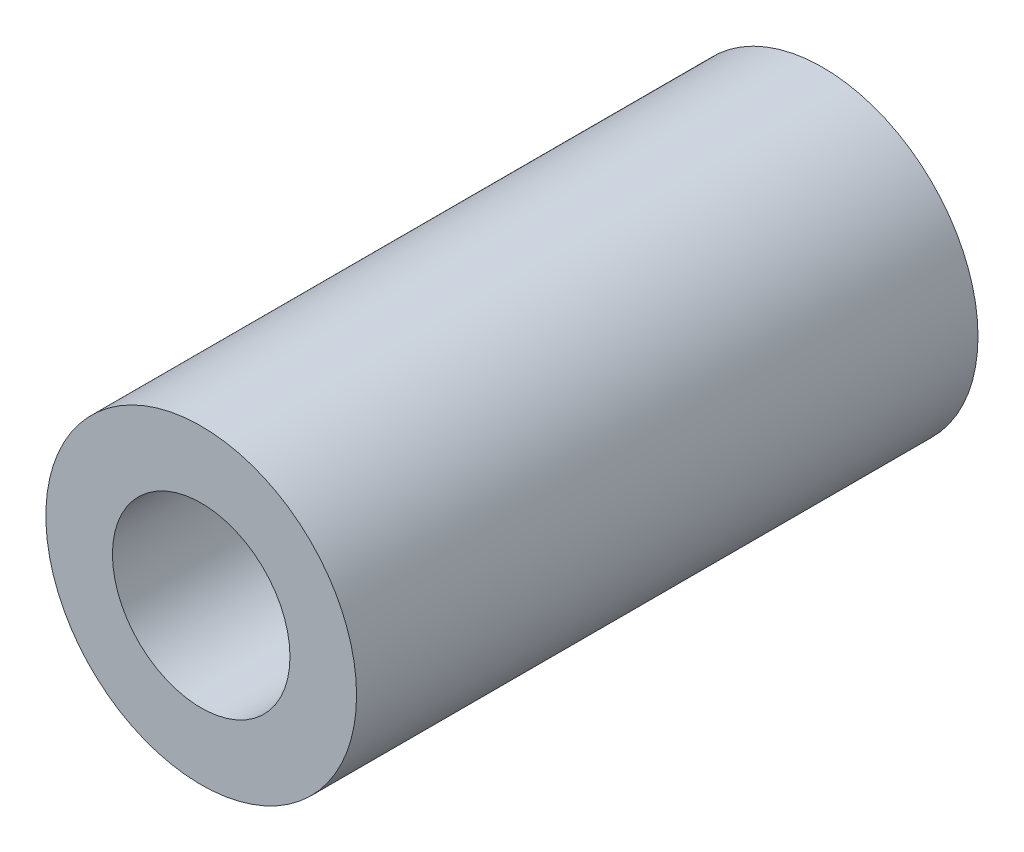
ISO-10303-21;
HEADER;
FILE_DESCRIPTION(('STEP AP214'),'2;1');
FILE_NAME('part.step','',(''),(''),'','','');
FILE_SCHEMA(('AUTOMOTIVE_DESIGN { 1 0 10303 214 1 1 1 1 }'));
ENDSEC;
DATA;
#1=APPLICATION_CONTEXT('core data for automotive mechanical design processes');
#2=APPLICATION_PROTOCOL_DEFINITION('international standard','automotive_design',2000,#1);
#3=PRODUCT_CONTEXT('',#1,'mechanical');
#4=PRODUCT('Part','Part','',(#3));
#5=PRODUCT_RELATED_PRODUCT_CATEGORY('part','',(#4));
#6=PRODUCT_DEFINITION_FORMATION('','',#4);
#7=PRODUCT_DEFINITION_CONTEXT('part definition',#1,'design');
#8=PRODUCT_DEFINITION('design','',#6,#7);
#9=PRODUCT_DEFINITION_SHAPE('','',#8);
#10=(LENGTH_UNIT() NAMED_UNIT(*) SI_UNIT(.MILLI.,.METRE.));
#11=(NAMED_UNIT(*) PLANE_ANGLE_UNIT() SI_UNIT($,.RADIAN.));
#12=(NAMED_UNIT(*) SI_UNIT($,.STERADIAN.) SOLID_ANGLE_UNIT());
#13=UNCERTAINTY_MEASURE_WITH_UNIT(LENGTH_MEASURE(1.E-05),#10,'distance_accuracy_value','');
#14=(GEOMETRIC_REPRESENTATION_CONTEXT(3) GLOBAL_UNCERTAINTY_ASSIGNED_CONTEXT((#13)) GLOBAL_UNIT_ASSIGNED_CONTEXT((#10,
#11,#12)) REPRESENTATION_CONTEXT('',''));
#15=CARTESIAN_POINT('',(0.,0.,0.));
#16=DIRECTION('',(0.,0.,1.));
#17=DIRECTION('',(1.,0.,0.));
#18=AXIS2_PLACEMENT_3D('',#15,#16,#17);
#19=CARTESIAN_POINT('',(0.,0.,14.));
#20=DIRECTION('',(0.,0.,1.));
#21=DIRECTION('',(1.,0.,0.));
#22=AXIS2_PLACEMENT_3D('',#19,#20,#21);
#23=PLANE('',#22);
#24=CARTESIAN_POINT('',(0.,0.,14.));
#25=DIRECTION('',(0.,0.,1.));
#26=DIRECTION('',(1.,0.,0.));
#27=AXIS2_PLACEMENT_3D('',#24,#25,#26);
#28=CIRCLE('',#27,3.5);
#29=CARTESIAN_POINT('',(3.5,0.,14.));
#30=VERTEX_POINT('',#29);
#31=EDGE_CURVE('E10',#30,#30,#28,.T.);
#32=ORIENTED_EDGE('',*,*,#31,.T.);
#33=EDGE_LOOP('',(#32));
#34=FACE_BOUND('',#33,.T.);
#35=CARTESIAN_POINT('',(0.,0.,14.));
#36=DIRECTION('',(0.,0.,1.));
#37=DIRECTION('',(1.,0.,0.));
#38=AXIS2_PLACEMENT_3D('',#35,#36,#37);
#39=CIRCLE('',#38,2.);
#40=CARTESIAN_POINT('',(2.,0.,14.));
#41=VERTEX_POINT('',#40);
#42=EDGE_CURVE('E44',#41,#41,#39,.T.);
#43=ORIENTED_EDGE('',*,*,#42,.F.);
#44=EDGE_LOOP('',(#43));
#45=FACE_BOUND('',#44,.T.);
#46=ADVANCED_FACE('F33',(#34,#45),#23,.T.);
#47=CARTESIAN_POINT('',(0.,0.,0.));
#48=DIRECTION('',(0.,0.,1.));
#49=DIRECTION('',(1.,0.,0.));
#50=AXIS2_PLACEMENT_3D('',#47,#48,#49);
#51=PLANE('',#50);
#52=CARTESIAN_POINT('',(0.,0.,0.));
#53=DIRECTION('',(0.,0.,1.));
#54=DIRECTION('',(1.,0.,0.));
#55=AXIS2_PLACEMENT_3D('',#52,#53,#54);
#56=CIRCLE('',#55,3.5);
#57=CARTESIAN_POINT('',(3.5,0.,0.));
#58=VERTEX_POINT('',#57);
#59=EDGE_CURVE('E37',#58,#58,#56,.T.);
#60=ORIENTED_EDGE('',*,*,#59,.F.);
#61=EDGE_LOOP('',(#60));
#62=FACE_BOUND('',#61,.T.);
#63=CARTESIAN_POINT('',(0.,0.,0.));
#64=DIRECTION('',(0.,0.,1.));
#65=DIRECTION('',(1.,0.,0.));
#66=AXIS2_PLACEMENT_3D('',#63,#64,#65);
#67=CIRCLE('',#66,2.);
#68=CARTESIAN_POINT('',(2.,0.,0.));
#69=VERTEX_POINT('',#68);
#70=EDGE_CURVE('E46',#69,#69,#67,.T.);
#71=ORIENTED_EDGE('',*,*,#70,.T.);
#72=EDGE_LOOP('',(#71));
#73=FACE_BOUND('',#72,.T.);
#74=ADVANCED_FACE('F56',(#62,#73),#51,.F.);
#75=CARTESIAN_POINT('',(0.,0.,14.));
#76=DIRECTION('',(0.,0.,-1.));
#77=DIRECTION('',(-1.,0.,0.));
#78=AXIS2_PLACEMENT_3D('',#75,#76,#77);
#79=CYLINDRICAL_SURFACE('',#78,3.5);
#80=ORIENTED_EDGE('',*,*,#31,.F.);
#81=EDGE_LOOP('',(#80));
#82=FACE_BOUND('',#81,.T.);
#83=ORIENTED_EDGE('',*,*,#59,.T.);
#84=EDGE_LOOP('',(#83));
#85=FACE_BOUND('',#84,.T.);
#86=ADVANCED_FACE('F35',(#82,#85),#79,.T.);
#87=CARTESIAN_POINT('',(0.,0.,14.));
#88=DIRECTION('',(0.,0.,-1.));
#89=DIRECTION('',(-1.,0.,0.));
#90=AXIS2_PLACEMENT_3D('',#87,#88,#89);
#91=CYLINDRICAL_SURFACE('',#90,2.);
#92=ORIENTED_EDGE('',*,*,#42,.T.);
#93=EDGE_LOOP('',(#92));
#94=FACE_BOUND('',#93,.T.);
#95=ORIENTED_EDGE('',*,*,#70,.F.);
#96=EDGE_LOOP('',(#95));
#97=FACE_BOUND('',#96,.T.);
#98=ADVANCED_FACE('F52',(#94,#97),#91,.F.);
#99=CLOSED_SHELL('',(#46,#74,#86,#98));
#100=MANIFOLD_SOLID_BREP('B2',#99);
#101=ADVANCED_BREP_SHAPE_REPRESENTATION('',(#18,#100),#14);
#102=SHAPE_DEFINITION_REPRESENTATION(#9,#101);
ENDSEC;
END-ISO-10303-21;
